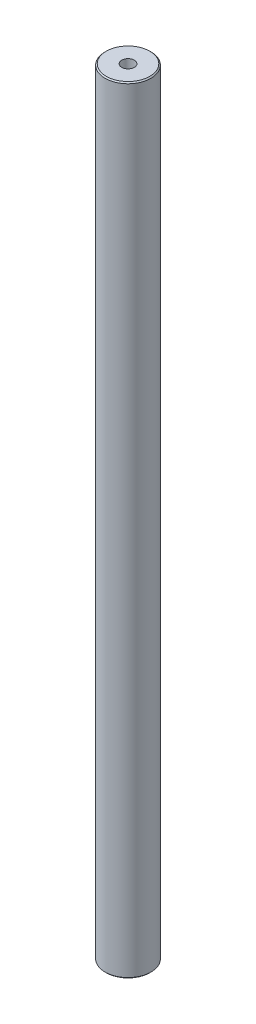
ISO-10303-21;
HEADER;
FILE_DESCRIPTION(('STEP AP214'),'2;1');
FILE_NAME('part.step','',(''),(''),'','','');
FILE_SCHEMA(('AUTOMOTIVE_DESIGN { 1 0 10303 214 1 1 1 1 }'));
ENDSEC;
DATA;
#1=APPLICATION_CONTEXT('core data for automotive mechanical design processes');
#2=APPLICATION_PROTOCOL_DEFINITION('international standard','automotive_design',2000,#1);
#3=PRODUCT_CONTEXT('',#1,'mechanical');
#4=PRODUCT('Part','Part','',(#3));
#5=PRODUCT_RELATED_PRODUCT_CATEGORY('part','',(#4));
#6=PRODUCT_DEFINITION_FORMATION('','',#4);
#7=PRODUCT_DEFINITION_CONTEXT('part definition',#1,'design');
#8=PRODUCT_DEFINITION('design','',#6,#7);
#9=PRODUCT_DEFINITION_SHAPE('','',#8);
#10=(LENGTH_UNIT() NAMED_UNIT(*) SI_UNIT(.MILLI.,.METRE.));
#11=(NAMED_UNIT(*) PLANE_ANGLE_UNIT() SI_UNIT($,.RADIAN.));
#12=(NAMED_UNIT(*) SI_UNIT($,.STERADIAN.) SOLID_ANGLE_UNIT());
#13=UNCERTAINTY_MEASURE_WITH_UNIT(LENGTH_MEASURE(1.E-05),#10,'distance_accuracy_value','');
#14=(GEOMETRIC_REPRESENTATION_CONTEXT(3) GLOBAL_UNCERTAINTY_ASSIGNED_CONTEXT((#13)) GLOBAL_UNIT_ASSIGNED_CONTEXT((#10,
#11,#12)) REPRESENTATION_CONTEXT('',''));
#15=CARTESIAN_POINT('',(0.,0.,0.));
#16=DIRECTION('',(0.,0.,1.));
#17=DIRECTION('',(1.,0.,0.));
#18=AXIS2_PLACEMENT_3D('',#15,#16,#17);
#19=CARTESIAN_POINT('',(0.,215.2,0.));
#20=DIRECTION('',(0.,-1.,0.));
#21=DIRECTION('',(0.,0.,-1.));
#22=AXIS2_PLACEMENT_3D('',#19,#20,#21);
#23=CYLINDRICAL_SURFACE('',#22,1.64999999999999);
#24=CARTESIAN_POINT('',(0.,205.2,0.));
#25=DIRECTION('',(0.,-1.,0.));
#26=DIRECTION('',(0.,0.,-1.));
#27=AXIS2_PLACEMENT_3D('',#24,#25,#26);
#28=CIRCLE('',#27,1.65);
#29=CARTESIAN_POINT('',(0.,205.2,-1.65));
#30=VERTEX_POINT('',#29);
#31=EDGE_CURVE('E59',#30,#30,#28,.T.);
#32=ORIENTED_EDGE('',*,*,#31,.T.);
#33=EDGE_LOOP('',(#32));
#34=FACE_BOUND('',#33,.T.);
#35=CARTESIAN_POINT('',(0.,215.200000000019,0.));
#36=DIRECTION('',(0.,-1.,0.));
#37=DIRECTION('',(0.,0.,-1.));
#38=AXIS2_PLACEMENT_3D('',#35,#36,#37);
#39=CIRCLE('',#38,1.64999999999998);
#40=CARTESIAN_POINT('',(0.,215.200000000019,-1.64999999999998));
#41=VERTEX_POINT('',#40);
#42=EDGE_CURVE('E10',#41,#41,#39,.T.);
#43=ORIENTED_EDGE('',*,*,#42,.F.);
#44=EDGE_LOOP('',(#43));
#45=FACE_BOUND('',#44,.T.);
#46=ADVANCED_FACE('F31',(#34,#45),#23,.F.);
#47=CARTESIAN_POINT('',(5.70000000000974,215.200000000019,0.));
#48=DIRECTION('',(0.,1.,0.));
#49=DIRECTION('',(0.,0.,1.));
#50=AXIS2_PLACEMENT_3D('',#47,#48,#49);
#51=PLANE('',#50);
#52=ORIENTED_EDGE('',*,*,#42,.T.);
#53=EDGE_LOOP('',(#52));
#54=FACE_BOUND('',#53,.T.);
#55=CARTESIAN_POINT('',(0.,215.200000000019,0.));
#56=DIRECTION('',(0.,-1.,0.));
#57=DIRECTION('',(0.,0.,-1.));
#58=AXIS2_PLACEMENT_3D('',#55,#56,#57);
#59=CIRCLE('',#58,5.70000000000974);
#60=CARTESIAN_POINT('',(0.,215.200000000019,-5.70000000000974));
#61=VERTEX_POINT('',#60);
#62=EDGE_CURVE('E37',#61,#61,#59,.T.);
#63=ORIENTED_EDGE('',*,*,#62,.F.);
#64=EDGE_LOOP('',(#63));
#65=FACE_BOUND('',#64,.T.);
#66=ADVANCED_FACE('F76',(#54,#65),#51,.T.);
#67=CARTESIAN_POINT('',(0.,214.900000000057,0.));
#68=DIRECTION('',(0.,-1.,0.));
#69=DIRECTION('',(0.,0.,-1.));
#70=AXIS2_PLACEMENT_3D('',#67,#68,#69);
#71=CONICAL_SURFACE('',#70,5.99999999997181,0.785398163397479);
#72=ORIENTED_EDGE('',*,*,#62,.T.);
#73=EDGE_LOOP('',(#72));
#74=FACE_BOUND('',#73,.T.);
#75=CARTESIAN_POINT('',(0.,214.900000000057,0.));
#76=DIRECTION('',(0.,-1.,0.));
#77=DIRECTION('',(0.,0.,-1.));
#78=AXIS2_PLACEMENT_3D('',#75,#76,#77);
#79=CIRCLE('',#78,5.99999999997181);
#80=CARTESIAN_POINT('',(0.,214.900000000057,-5.99999999997181));
#81=VERTEX_POINT('',#80);
#82=EDGE_CURVE('E41',#81,#81,#79,.T.);
#83=ORIENTED_EDGE('',*,*,#82,.F.);
#84=EDGE_LOOP('',(#83));
#85=FACE_BOUND('',#84,.T.);
#86=ADVANCED_FACE('F80',(#74,#85),#71,.T.);
#87=CARTESIAN_POINT('',(0.,215.2,0.));
#88=DIRECTION('',(0.,-1.,0.));
#89=DIRECTION('',(0.,0.,-1.));
#90=AXIS2_PLACEMENT_3D('',#87,#88,#89);
#91=CYLINDRICAL_SURFACE('',#90,5.99999999997181);
#92=ORIENTED_EDGE('',*,*,#82,.T.);
#93=EDGE_LOOP('',(#92));
#94=FACE_BOUND('',#93,.T.);
#95=CARTESIAN_POINT('',(0.,12.2999999999247,0.));
#96=DIRECTION('',(0.,-1.,0.));
#97=DIRECTION('',(0.,0.,-1.));
#98=AXIS2_PLACEMENT_3D('',#95,#96,#97);
#99=CIRCLE('',#98,5.99999999997181);
#100=CARTESIAN_POINT('',(0.,12.2999999999247,-5.99999999997181));
#101=VERTEX_POINT('',#100);
#102=EDGE_CURVE('E45',#101,#101,#99,.T.);
#103=ORIENTED_EDGE('',*,*,#102,.F.);
#104=EDGE_LOOP('',(#103));
#105=FACE_BOUND('',#104,.T.);
#106=ADVANCED_FACE('F84',(#94,#105),#91,.T.);
#107=CARTESIAN_POINT('',(0.,12.,0.));
#108=DIRECTION('',(0.,1.,0.));
#109=DIRECTION('',(0.,0.,1.));
#110=AXIS2_PLACEMENT_3D('',#107,#108,#109);
#111=CONICAL_SURFACE('',#110,5.70000000004711,0.785398163397461);
#112=ORIENTED_EDGE('',*,*,#102,.T.);
#113=EDGE_LOOP('',(#112));
#114=FACE_BOUND('',#113,.T.);
#115=CARTESIAN_POINT('',(0.,12.,0.));
#116=DIRECTION('',(0.,-1.,0.));
#117=DIRECTION('',(0.,0.,-1.));
#118=AXIS2_PLACEMENT_3D('',#115,#116,#117);
#119=CIRCLE('',#118,5.70000000004711);
#120=CARTESIAN_POINT('',(0.,12.,-5.70000000004711));
#121=VERTEX_POINT('',#120);
#122=EDGE_CURVE('E50',#121,#121,#119,.T.);
#123=ORIENTED_EDGE('',*,*,#122,.F.);
#124=EDGE_LOOP('',(#123));
#125=FACE_BOUND('',#124,.T.);
#126=ADVANCED_FACE('F90',(#114,#125),#111,.T.);
#127=CARTESIAN_POINT('',(1.65,12.,0.));
#128=DIRECTION('',(0.,-1.,0.));
#129=DIRECTION('',(0.,0.,-1.));
#130=AXIS2_PLACEMENT_3D('',#127,#128,#129);
#131=PLANE('',#130);
#132=ORIENTED_EDGE('',*,*,#122,.T.);
#133=EDGE_LOOP('',(#132));
#134=FACE_BOUND('',#133,.T.);
#135=CARTESIAN_POINT('',(0.,12.,0.));
#136=DIRECTION('',(0.,-1.,0.));
#137=DIRECTION('',(0.,0.,-1.));
#138=AXIS2_PLACEMENT_3D('',#135,#136,#137);
#139=CIRCLE('',#138,1.65);
#140=CARTESIAN_POINT('',(0.,12.,-1.65));
#141=VERTEX_POINT('',#140);
#142=EDGE_CURVE('E53',#141,#141,#139,.T.);
#143=ORIENTED_EDGE('',*,*,#142,.F.);
#144=EDGE_LOOP('',(#143));
#145=FACE_BOUND('',#144,.T.);
#146=ADVANCED_FACE('F94',(#134,#145),#131,.T.);
#147=CARTESIAN_POINT('',(0.,215.2,0.));
#148=DIRECTION('',(0.,-1.,0.));
#149=DIRECTION('',(0.,0.,-1.));
#150=AXIS2_PLACEMENT_3D('',#147,#148,#149);
#151=CYLINDRICAL_SURFACE('',#150,1.65);
#152=ORIENTED_EDGE('',*,*,#142,.T.);
#153=EDGE_LOOP('',(#152));
#154=FACE_BOUND('',#153,.T.);
#155=CARTESIAN_POINT('',(0.,22.,0.));
#156=DIRECTION('',(0.,-1.,0.));
#157=DIRECTION('',(0.,0.,-1.));
#158=AXIS2_PLACEMENT_3D('',#155,#156,#157);
#159=CIRCLE('',#158,1.65);
#160=CARTESIAN_POINT('',(0.,22.,-1.65));
#161=VERTEX_POINT('',#160);
#162=EDGE_CURVE('E56',#161,#161,#159,.T.);
#163=ORIENTED_EDGE('',*,*,#162,.F.);
#164=EDGE_LOOP('',(#163));
#165=FACE_BOUND('',#164,.T.);
#166=ADVANCED_FACE('F72',(#154,#165),#151,.F.);
#167=CARTESIAN_POINT('',(0.,22.,0.));
#168=DIRECTION('',(0.,-1.,0.));
#169=DIRECTION('',(0.,0.,-1.));
#170=AXIS2_PLACEMENT_3D('',#167,#168,#169);
#171=PLANE('',#170);
#172=ORIENTED_EDGE('',*,*,#162,.T.);
#173=EDGE_LOOP('',(#172));
#174=FACE_BOUND('',#173,.T.);
#175=ADVANCED_FACE('F67',(#174),#171,.T.);
#176=CARTESIAN_POINT('',(1.65,205.2,0.));
#177=DIRECTION('',(0.,1.,0.));
#178=DIRECTION('',(0.,0.,1.));
#179=AXIS2_PLACEMENT_3D('',#176,#177,#178);
#180=PLANE('',#179);
#181=ORIENTED_EDGE('',*,*,#31,.F.);
#182=EDGE_LOOP('',(#181));
#183=FACE_BOUND('',#182,.T.);
#184=ADVANCED_FACE('F65',(#183),#180,.T.);
#185=CLOSED_SHELL('',(#46,#66,#86,#106,#126,#146,#166,#175,#184));
#186=MANIFOLD_SOLID_BREP('B2',#185);
#187=ADVANCED_BREP_SHAPE_REPRESENTATION('',(#18,#186),#14);
#188=SHAPE_DEFINITION_REPRESENTATION(#9,#187);
ENDSEC;
END-ISO-10303-21;
